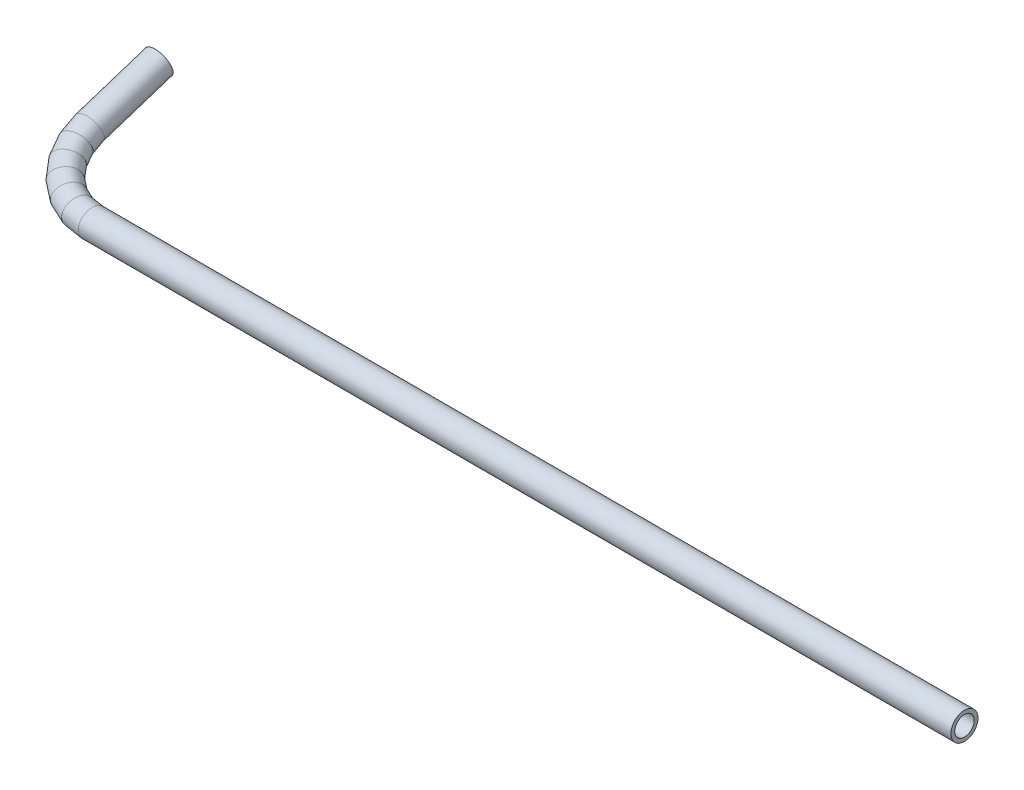
ISO-10303-21;
HEADER;
FILE_DESCRIPTION(('STEP AP214'),'2;1');
FILE_NAME('part.step','',(''),(''),'','','');
FILE_SCHEMA(('AUTOMOTIVE_DESIGN { 1 0 10303 214 1 1 1 1 }'));
ENDSEC;
DATA;
#1=APPLICATION_CONTEXT('core data for automotive mechanical design processes');
#2=APPLICATION_PROTOCOL_DEFINITION('international standard','automotive_design',2000,#1);
#3=PRODUCT_CONTEXT('',#1,'mechanical');
#4=PRODUCT('Part','Part','',(#3));
#5=PRODUCT_RELATED_PRODUCT_CATEGORY('part','',(#4));
#6=PRODUCT_DEFINITION_FORMATION('','',#4);
#7=PRODUCT_DEFINITION_CONTEXT('part definition',#1,'design');
#8=PRODUCT_DEFINITION('design','',#6,#7);
#9=PRODUCT_DEFINITION_SHAPE('','',#8);
#10=(LENGTH_UNIT() NAMED_UNIT(*) SI_UNIT(.MILLI.,.METRE.));
#11=(NAMED_UNIT(*) PLANE_ANGLE_UNIT() SI_UNIT($,.RADIAN.));
#12=(NAMED_UNIT(*) SI_UNIT($,.STERADIAN.) SOLID_ANGLE_UNIT());
#13=UNCERTAINTY_MEASURE_WITH_UNIT(LENGTH_MEASURE(1.E-05),#10,'distance_accuracy_value','');
#14=(GEOMETRIC_REPRESENTATION_CONTEXT(3) GLOBAL_UNCERTAINTY_ASSIGNED_CONTEXT((#13)) GLOBAL_UNIT_ASSIGNED_CONTEXT((#10,
#11,#12)) REPRESENTATION_CONTEXT('',''));
#15=CARTESIAN_POINT('',(0.,0.,0.));
#16=DIRECTION('',(0.,0.,1.));
#17=DIRECTION('',(1.,0.,0.));
#18=AXIS2_PLACEMENT_3D('',#15,#16,#17);
#19=CARTESIAN_POINT('',(-2114.18796047896,14.6909208859759,-45.2140053567118));
#20=DIRECTION('',(0.,0.309016994374947,-0.951056516295154));
#21=DIRECTION('',(0.,0.951056516295154,0.309016994374947));
#22=AXIS2_PLACEMENT_3D('',#19,#20,#21);
#23=CYLINDRICAL_SURFACE('',#22,3.175);
#24=CARTESIAN_POINT('',(-2114.18796047896,14.8328157299976,-45.6507127821674));
#25=DIRECTION('',(-0.0654031292301812,0.308355365269414,-0.949020231289337));
#26=DIRECTION('',(-0.997858923238601,-0.0202106784174268,0.0622020722404579));
#27=AXIS2_PLACEMENT_3D('',#24,#25,#26);
#28=ELLIPSE('',#27,3.18181250481318,3.175);
#29=CARTESIAN_POINT('',(-2117.36296047896,14.7685091406783,-45.4527974508874));
#30=VERTEX_POINT('',#29);
#31=EDGE_CURVE('E45',#30,#30,#28,.T.);
#32=ORIENTED_EDGE('',*,*,#31,.T.);
#33=EDGE_LOOP('',(#32));
#34=FACE_BOUND('',#33,.T.);
#35=CARTESIAN_POINT('',(-2114.18796047896,20.1324571835283,-61.9613320366301));
#36=DIRECTION('',(0.,-0.309016994374947,0.951056516295154));
#37=DIRECTION('',(0.951056516295154,-0.293892626146236,-0.0954915028125263));
#38=AXIS2_PLACEMENT_3D('',#35,#36,#37);
#39=CIRCLE('',#38,3.175);
#40=CARTESIAN_POINT('',(-2111.16835603972,19.199348095514,-62.2645175580599));
#41=VERTEX_POINT('',#40);
#42=EDGE_CURVE('E80',#41,#41,#39,.T.);
#43=ORIENTED_EDGE('',*,*,#42,.T.);
#44=EDGE_LOOP('',(#43));
#45=FACE_BOUND('',#44,.T.);
#46=ADVANCED_FACE('F39',(#34,#45),#23,.T.);
#47=CARTESIAN_POINT('',(-2113.56962555546,13.3814494203846,-41.1838665846604));
#48=DIRECTION('',(-0.130526192220127,0.306373311150218,-0.942920095956898));
#49=DIRECTION('',(0.,0.951056516295154,0.309016994374947));
#50=AXIS2_PLACEMENT_3D('',#47,#48,#49);
#51=CYLINDRICAL_SURFACE('',#50,3.175);
#52=CARTESIAN_POINT('',(-2113.67684787329,13.6331234789287,-41.9584396913768));
#53=DIRECTION('',(-0.258819045102505,0.298487495628987,-0.918650051350003));
#54=DIRECTION('',(-0.965925826289073,-0.0799794834045707,0.246151539386026));
#55=AXIS2_PLACEMENT_3D('',#52,#53,#54);
#56=ELLIPSE('',#55,3.20239694984194,3.175);
#57=CARTESIAN_POINT('',(-2116.77012579318,13.376997425224,-41.170164752448));
#58=VERTEX_POINT('',#57);
#59=EDGE_CURVE('E94',#58,#58,#56,.T.);
#60=ORIENTED_EDGE('',*,*,#59,.T.);
#61=EDGE_LOOP('',(#60));
#62=FACE_BOUND('',#61,.T.);
#63=ORIENTED_EDGE('',*,*,#31,.F.);
#64=EDGE_LOOP('',(#63));
#65=FACE_BOUND('',#64,.T.);
#66=ADVANCED_FACE('F103',(#62,#65),#51,.T.);
#67=CARTESIAN_POINT('',(-2111.86398160601,12.2806653848193,-37.7960016804169));
#68=DIRECTION('',(-0.382683432364989,0.285494476301182,-0.878661649666619));
#69=DIRECTION('',(-0.916819345772618,0.,0.399302250453298));
#70=AXIS2_PLACEMENT_3D('',#67,#68,#69);
#71=CYLINDRICAL_SURFACE('',#70,3.175);
#72=CARTESIAN_POINT('',(-2112.17834153572,12.5151882721854,-38.5177889099537));
#73=DIRECTION('',(-0.499999999999964,0.267616567329824,-0.823639103546352));
#74=DIRECTION('',(-0.866025403784459,-0.154508497187462,0.475528258147543));
#75=AXIS2_PLACEMENT_3D('',#72,#73,#74);
#76=ELLIPSE('',#75,3.20239694984201,3.175);
#77=CARTESIAN_POINT('',(-2114.95169864729,12.0203907320676,-36.9949586664984));
#78=VERTEX_POINT('',#77);
#79=EDGE_CURVE('E95',#78,#78,#76,.T.);
#80=ORIENTED_EDGE('',*,*,#79,.T.);
#81=EDGE_LOOP('',(#80));
#82=FACE_BOUND('',#81,.T.);
#83=ORIENTED_EDGE('',*,*,#59,.F.);
#84=EDGE_LOOP('',(#83));
#85=FACE_BOUND('',#84,.T.);
#86=ADVANCED_FACE('F104',(#82,#85),#71,.T.);
#87=CARTESIAN_POINT('',(-2109.29448776485,11.3538061776507,-34.9434223572345));
#88=DIRECTION('',(-0.608761429008741,0.245159664694118,-0.75452386400849));
#89=DIRECTION('',(-0.778274692967017,0.,0.627923962185786));
#90=AXIS2_PLACEMENT_3D('',#87,#88,#89);
#91=CYLINDRICAL_SURFACE('',#90,3.175);
#92=CARTESIAN_POINT('',(-2109.79456219676,11.5551955466312,-35.5632351027078));
#93=DIRECTION('',(-0.707106781186574,0.218508012224402,-0.672498511963932));
#94=DIRECTION('',(-0.707106781186521,-0.218508012224418,0.672498511963983));
#95=AXIS2_PLACEMENT_3D('',#92,#93,#94);
#96=ELLIPSE('',#95,3.20239694984199,3.175);
#97=CARTESIAN_POINT('',(-2112.05899879604,10.8554461547677,-33.409627919221));
#98=VERTEX_POINT('',#97);
#99=EDGE_CURVE('E90',#98,#98,#96,.T.);
#100=ORIENTED_EDGE('',*,*,#99,.T.);
#101=EDGE_LOOP('',(#100));
#102=FACE_BOUND('',#101,.T.);
#103=ORIENTED_EDGE('',*,*,#79,.F.);
#104=EDGE_LOOP('',(#103));
#105=FACE_BOUND('',#104,.T.);
#106=ADVANCED_FACE('F109',(#102,#105),#91,.T.);
#107=CARTESIAN_POINT('',(-2106.03625079099,10.6640357221394,-32.8205271818773));
#108=DIRECTION('',(-0.793353340291265,0.188117627083661,-0.578966523927856));
#109=DIRECTION('',(-0.589490998187417,0.,0.807774945796168));
#110=AXIS2_PLACEMENT_3D('',#107,#108,#109);
#111=CYLINDRICAL_SURFACE('',#110,3.175);
#112=CARTESIAN_POINT('',(-2106.68796047896,10.8185672200502,-33.2961262289724));
#113=DIRECTION('',(-0.866025403784444,0.154508497187471,-0.475528258147568));
#114=DIRECTION('',(-0.49999999999999,-0.267616567329823,0.823639103546336));
#115=AXIS2_PLACEMENT_3D('',#112,#113,#114);
#116=ELLIPSE('',#115,3.20239694984197,3.175);
#117=CARTESIAN_POINT('',(-2108.28915895388,9.96155274110603,-30.658506876005));
#118=VERTEX_POINT('',#117);
#119=EDGE_CURVE('E88',#118,#118,#116,.T.);
#120=ORIENTED_EDGE('',*,*,#119,.T.);
#121=EDGE_LOOP('',(#120));
#122=FACE_BOUND('',#121,.T.);
#123=ORIENTED_EDGE('',*,*,#99,.F.);
#124=EDGE_LOOP('',(#123));
#125=FACE_BOUND('',#124,.T.);
#126=ADVANCED_FACE('F169',(#122,#125),#111,.T.);
#127=CARTESIAN_POINT('',(-2102.3113141497,10.2583607349288,-31.5719879522953));
#128=DIRECTION('',(-0.923879532511276,0.118255684066556,-0.363953572029039));
#129=DIRECTION('',(-0.366525415369712,0.,0.93040803945799));
#130=AXIS2_PLACEMENT_3D('',#127,#128,#129);
#131=CYLINDRICAL_SURFACE('',#130,3.175);
#132=CARTESIAN_POINT('',(-2103.0702461555,10.3555032955627,-31.8709620119174));
#133=DIRECTION('',(-0.965925826289065,0.0799794834045782,-0.246151539386052));
#134=DIRECTION('',(-0.258819045102532,-0.29848749562898,0.918650051349998));
#135=AXIS2_PLACEMENT_3D('',#132,#133,#134);
#136=ELLIPSE('',#135,3.20239694984199,3.175);
#137=CARTESIAN_POINT('',(-2103.89908747609,9.3996278499945,-28.929079889502));
#138=VERTEX_POINT('',#137);
#139=EDGE_CURVE('E82',#138,#138,#136,.T.);
#140=ORIENTED_EDGE('',*,*,#139,.T.);
#141=EDGE_LOOP('',(#140));
#142=FACE_BOUND('',#141,.T.);
#143=ORIENTED_EDGE('',*,*,#119,.F.);
#144=EDGE_LOOP('',(#143));
#145=FACE_BOUND('',#144,.T.);
#146=ADVANCED_FACE('F163',(#142,#145),#131,.T.);
#147=CARTESIAN_POINT('',(-2098.73270747824,10.1790398206875,-31.3278632803811));
#148=DIRECTION('',(-0.991444861373811,0.0403348116070459,-0.124137785658069));
#149=DIRECTION('',(-0.124238888735265,0.,0.992252336115076));
#150=AXIS2_PLACEMENT_3D('',#147,#148,#149);
#151=CYLINDRICAL_SURFACE('',#150,3.175);
#152=CARTESIAN_POINT('',(-2099.18796047896,10.1975608143733,-31.3848650377401));
#153=DIRECTION('',(-0.997858923238604,0.0202106784174145,-0.0622020722404191));
#154=DIRECTION('',(-0.0654031292301406,-0.308355365269418,0.949020231289338));
#155=AXIS2_PLACEMENT_3D('',#152,#153,#154);
#156=ELLIPSE('',#155,3.18181250481317,3.175);
#157=CARTESIAN_POINT('',(-2099.3960609734,9.21643185723279,-28.365260598503));
#158=VERTEX_POINT('',#157);
#159=EDGE_CURVE('E78',#158,#158,#156,.T.);
#160=ORIENTED_EDGE('',*,*,#159,.T.);
#161=EDGE_LOOP('',(#160));
#162=FACE_BOUND('',#161,.T.);
#163=ORIENTED_EDGE('',*,*,#139,.F.);
#164=EDGE_LOOP('',(#163));
#165=FACE_BOUND('',#164,.T.);
#166=ADVANCED_FACE('F159',(#162,#165),#151,.T.);
#167=CARTESIAN_POINT('',(-1894.68796047896,10.1975608143733,-31.3848650377401));
#168=DIRECTION('',(-1.,0.,0.));
#169=DIRECTION('',(0.,0.,1.));
#170=AXIS2_PLACEMENT_3D('',#167,#168,#169);
#171=CYLINDRICAL_SURFACE('',#170,3.175);
#172=CARTESIAN_POINT('',(-1894.68796047896,10.1975608143733,-31.3848650377401));
#173=DIRECTION('',(1.,0.,0.));
#174=DIRECTION('',(0.,0.,-1.));
#175=AXIS2_PLACEMENT_3D('',#172,#173,#174);
#176=CIRCLE('',#175,3.175);
#177=CARTESIAN_POINT('',(-1894.68796047896,10.1975608143733,-34.5598650377401));
#178=VERTEX_POINT('',#177);
#179=EDGE_CURVE('E74',#178,#178,#176,.T.);
#180=ORIENTED_EDGE('',*,*,#179,.F.);
#181=EDGE_LOOP('',(#180));
#182=FACE_BOUND('',#181,.T.);
#183=ORIENTED_EDGE('',*,*,#159,.F.);
#184=EDGE_LOOP('',(#183));
#185=FACE_BOUND('',#184,.T.);
#186=ADVANCED_FACE('F156',(#182,#185),#171,.T.);
#187=CARTESIAN_POINT('',(-2114.18796047896,20.1324571835283,-61.9613320366301));
#188=DIRECTION('',(0.,-0.309016994374947,0.951056516295154));
#189=DIRECTION('',(0.951056516295154,-0.293892626146236,-0.0954915028125263));
#190=AXIS2_PLACEMENT_3D('',#187,#188,#189);
#191=PLANE('',#190);
#192=CARTESIAN_POINT('',(-2114.18796047896,20.1324571835283,-61.9613320366301));
#193=DIRECTION('',(0.,-0.309016994374947,0.951056516295154));
#194=DIRECTION('',(0.951056516295154,-0.293892626146236,-0.0954915028125263));
#195=AXIS2_PLACEMENT_3D('',#192,#193,#194);
#196=CIRCLE('',#195,2.286);
#197=CARTESIAN_POINT('',(-2112.01384528271,19.460618640158,-62.1796256120596));
#198=VERTEX_POINT('',#197);
#199=EDGE_CURVE('E72',#198,#198,#196,.F.);
#200=ORIENTED_EDGE('',*,*,#199,.F.);
#201=EDGE_LOOP('',(#200));
#202=FACE_BOUND('',#201,.T.);
#203=ORIENTED_EDGE('',*,*,#42,.F.);
#204=EDGE_LOOP('',(#203));
#205=FACE_BOUND('',#204,.T.);
#206=ADVANCED_FACE('F155',(#202,#205),#191,.F.);
#207=CARTESIAN_POINT('',(-1894.68796047896,10.1975608143733,-31.3848650377401));
#208=DIRECTION('',(1.,0.,0.));
#209=DIRECTION('',(0.,0.,-1.));
#210=AXIS2_PLACEMENT_3D('',#207,#208,#209);
#211=PLANE('',#210);
#212=CARTESIAN_POINT('',(-1894.68796047896,10.1975608143733,-31.3848650377401));
#213=DIRECTION('',(1.,0.,0.));
#214=DIRECTION('',(0.,0.,-1.));
#215=AXIS2_PLACEMENT_3D('',#212,#213,#214);
#216=CIRCLE('',#215,2.286);
#217=CARTESIAN_POINT('',(-1894.68796047896,10.1975608143733,-33.6708650377401));
#218=VERTEX_POINT('',#217);
#219=EDGE_CURVE('E46',#218,#218,#216,.F.);
#220=ORIENTED_EDGE('',*,*,#219,.T.);
#221=EDGE_LOOP('',(#220));
#222=FACE_BOUND('',#221,.T.);
#223=ORIENTED_EDGE('',*,*,#179,.T.);
#224=EDGE_LOOP('',(#223));
#225=FACE_BOUND('',#224,.T.);
#226=ADVANCED_FACE('F146',(#222,#225),#211,.T.);
#227=CARTESIAN_POINT('',(-2114.18796047896,14.7219989664594,-45.3096538533828));
#228=DIRECTION('',(0.,0.309016994374947,-0.951056516295154));
#229=DIRECTION('',(0.,0.951056516295154,0.309016994374947));
#230=AXIS2_PLACEMENT_3D('',#227,#228,#229);
#231=CYLINDRICAL_SURFACE('',#230,2.286);
#232=CARTESIAN_POINT('',(-2114.18796047896,14.8328157299975,-45.6507127821674));
#233=DIRECTION('',(-0.0654031292301812,0.308355365269414,-0.949020231289337));
#234=DIRECTION('',(-0.997858923238601,-0.020210678417426,0.0622020722404581));
#235=AXIS2_PLACEMENT_3D('',#232,#233,#234);
#236=ELLIPSE('',#235,2.29090500346549,2.286);
#237=CARTESIAN_POINT('',(-2116.47396047896,14.7865149856876,-45.5082137436458));
#238=VERTEX_POINT('',#237);
#239=EDGE_CURVE('E67',#238,#238,#236,.F.);
#240=ORIENTED_EDGE('',*,*,#239,.T.);
#241=EDGE_LOOP('',(#240));
#242=FACE_BOUND('',#241,.T.);
#243=ORIENTED_EDGE('',*,*,#199,.T.);
#244=EDGE_LOOP('',(#243));
#245=FACE_BOUND('',#244,.T.);
#246=ADVANCED_FACE('F145',(#242,#245),#231,.F.);
#247=CARTESIAN_POINT('',(-2113.59599307107,13.4433397040646,-41.374345291854));
#248=DIRECTION('',(-0.130526192220127,0.306373311150218,-0.942920095956898));
#249=DIRECTION('',(0.,0.951056516295154,0.309016994374947));
#250=AXIS2_PLACEMENT_3D('',#247,#248,#249);
#251=CYLINDRICAL_SURFACE('',#250,2.286);
#252=CARTESIAN_POINT('',(-2113.67684787329,13.6331234789288,-41.9584396913767));
#253=DIRECTION('',(-0.258819045102505,0.298487495628986,-0.918650051350003));
#254=DIRECTION('',(-0.965925826289073,-0.0799794834045707,0.246151539386026));
#255=AXIS2_PLACEMENT_3D('',#252,#253,#254);
#256=ELLIPSE('',#255,2.3057258038862,2.286);
#257=CARTESIAN_POINT('',(-2115.90400797561,13.4487127202614,-41.3908817353481));
#258=VERTEX_POINT('',#257);
#259=EDGE_CURVE('E63',#258,#258,#256,.F.);
#260=ORIENTED_EDGE('',*,*,#259,.T.);
#261=EDGE_LOOP('',(#260));
#262=FACE_BOUND('',#261,.T.);
#263=ORIENTED_EDGE('',*,*,#239,.F.);
#264=EDGE_LOOP('',(#263));
#265=FACE_BOUND('',#264,.T.);
#266=ADVANCED_FACE('F139',(#262,#265),#251,.F.);
#267=CARTESIAN_POINT('',(-2111.94128725022,12.3383379479454,-37.9734995784962));
#268=DIRECTION('',(-0.382683432364989,0.285494476301182,-0.87866164966662));
#269=DIRECTION('',(-0.916819345772618,0.,0.399302250453298));
#270=AXIS2_PLACEMENT_3D('',#267,#268,#269);
#271=CYLINDRICAL_SURFACE('',#270,2.286);
#272=CARTESIAN_POINT('',(-2112.17834153572,12.5151882721853,-38.5177889099538));
#273=DIRECTION('',(-0.499999999999964,0.267616567329824,-0.823639103546352));
#274=DIRECTION('',(-0.866025403784459,-0.154508497187461,0.475528258147543));
#275=AXIS2_PLACEMENT_3D('',#272,#273,#274);
#276=ELLIPSE('',#275,2.30572580388625,2.286);
#277=CARTESIAN_POINT('',(-2114.17515865605,12.1589340433005,-37.4213511346659));
#278=VERTEX_POINT('',#277);
#279=EDGE_CURVE('E65',#278,#278,#276,.F.);
#280=ORIENTED_EDGE('',*,*,#279,.T.);
#281=EDGE_LOOP('',(#280));
#282=FACE_BOUND('',#281,.T.);
#283=ORIENTED_EDGE('',*,*,#259,.F.);
#284=EDGE_LOOP('',(#283));
#285=FACE_BOUND('',#284,.T.);
#286=ADVANCED_FACE('F136',(#282,#285),#271,.F.);
#287=CARTESIAN_POINT('',(-2109.41746328577,11.4033307303538,-35.0958432577746));
#288=DIRECTION('',(-0.608761429008741,0.245159664694118,-0.75452386400849));
#289=DIRECTION('',(-0.778274692967016,0.,0.627923962185786));
#290=AXIS2_PLACEMENT_3D('',#287,#288,#289);
#291=CYLINDRICAL_SURFACE('',#290,2.286);
#292=CARTESIAN_POINT('',(-2109.79456219676,11.5551955466312,-35.5632351027079));
#293=DIRECTION('',(-0.707106781186574,0.218508012224402,-0.672498511963932));
#294=DIRECTION('',(-0.707106781186521,-0.218508012224418,0.672498511963983));
#295=AXIS2_PLACEMENT_3D('',#292,#293,#294);
#296=ELLIPSE('',#295,2.30572580388623,2.286);
#297=CARTESIAN_POINT('',(-2111.42495654824,11.0513759844895,-34.0126379305974));
#298=VERTEX_POINT('',#297);
#299=EDGE_CURVE('E56',#298,#298,#296,.F.);
#300=ORIENTED_EDGE('',*,*,#299,.T.);
#301=EDGE_LOOP('',(#300));
#302=FACE_BOUND('',#301,.T.);
#303=ORIENTED_EDGE('',*,*,#279,.F.);
#304=EDGE_LOOP('',(#303));
#305=FACE_BOUND('',#304,.T.);
#306=ADVANCED_FACE('F135',(#302,#305),#291,.F.);
#307=CARTESIAN_POINT('',(-2106.19651561009,10.702037247996,-32.9374838523937));
#308=DIRECTION('',(-0.793353340291266,0.188117627083661,-0.578966523927856));
#309=DIRECTION('',(-0.589490998187417,0.,0.807774945796168));
#310=AXIS2_PLACEMENT_3D('',#307,#308,#309);
#311=CYLINDRICAL_SURFACE('',#310,2.286);
#312=CARTESIAN_POINT('',(-2106.68796047896,10.8185672200502,-33.2961262289722));
#313=DIRECTION('',(-0.866025403784444,0.154508497187471,-0.475528258147568));
#314=DIRECTION('',(-0.499999999999991,-0.267616567329823,0.823639103546336));
#315=AXIS2_PLACEMENT_3D('',#312,#313,#314);
#316=ELLIPSE('',#315,2.30572580388621,2.286);
#317=CARTESIAN_POINT('',(-2107.8408233809,10.2015167952104,-31.3970402948357));
#318=VERTEX_POINT('',#317);
#319=EDGE_CURVE('E57',#318,#318,#316,.F.);
#320=ORIENTED_EDGE('',*,*,#319,.T.);
#321=EDGE_LOOP('',(#320));
#322=FACE_BOUND('',#321,.T.);
#323=ORIENTED_EDGE('',*,*,#299,.F.);
#324=EDGE_LOOP('',(#323));
#325=FACE_BOUND('',#324,.T.);
#326=ADVANCED_FACE('F126',(#322,#325),#311,.F.);
#327=CARTESIAN_POINT('',(-2102.49794648441,10.2822494927525,-31.6455099889726));
#328=DIRECTION('',(-0.923879532511276,0.118255684066556,-0.363953572029039));
#329=DIRECTION('',(-0.366525415369712,0.,0.93040803945799));
#330=AXIS2_PLACEMENT_3D('',#327,#328,#329);
#331=CYLINDRICAL_SURFACE('',#330,2.286);
#332=CARTESIAN_POINT('',(-2103.0702461555,10.3555032955627,-31.8709620119174));
#333=DIRECTION('',(-0.965925826289065,0.0799794834045782,-0.246151539386052));
#334=DIRECTION('',(-0.258819045102532,-0.29848749562898,0.918650051349998));
#335=AXIS2_PLACEMENT_3D('',#332,#333,#334);
#336=ELLIPSE('',#335,2.30572580388623,2.286);
#337=CARTESIAN_POINT('',(-2103.66701190633,9.6672729747536,-29.7528068837783));
#338=VERTEX_POINT('',#337);
#339=EDGE_CURVE('E51',#338,#338,#336,.F.);
#340=ORIENTED_EDGE('',*,*,#339,.T.);
#341=EDGE_LOOP('',(#340));
#342=FACE_BOUND('',#341,.T.);
#343=ORIENTED_EDGE('',*,*,#319,.F.);
#344=EDGE_LOOP('',(#343));
#345=FACE_BOUND('',#344,.T.);
#346=ADVANCED_FACE('F121',(#342,#345),#331,.F.);
#347=CARTESIAN_POINT('',(-2098.83241786233,10.1830963241945,-31.3403479144432));
#348=DIRECTION('',(-0.991444861373811,0.0403348116070459,-0.124137785658069));
#349=DIRECTION('',(-0.124238888735265,0.,0.992252336115076));
#350=AXIS2_PLACEMENT_3D('',#347,#348,#349);
#351=CYLINDRICAL_SURFACE('',#350,2.286);
#352=CARTESIAN_POINT('',(-2099.18796047896,10.1975608143733,-31.3848650377401));
#353=DIRECTION('',(-0.997858923238604,0.0202106784174146,-0.0622020722404192));
#354=DIRECTION('',(-0.0654031292301406,-0.308355365269418,0.949020231289338));
#355=AXIS2_PLACEMENT_3D('',#352,#353,#354);
#356=ELLIPSE('',#355,2.29090500346548,2.286);
#357=CARTESIAN_POINT('',(-2099.33779283495,9.49114796523212,-29.2107498414894));
#358=VERTEX_POINT('',#357);
#359=EDGE_CURVE('E10',#358,#358,#356,.F.);
#360=ORIENTED_EDGE('',*,*,#359,.T.);
#361=EDGE_LOOP('',(#360));
#362=FACE_BOUND('',#361,.T.);
#363=ORIENTED_EDGE('',*,*,#339,.F.);
#364=EDGE_LOOP('',(#363));
#365=FACE_BOUND('',#364,.T.);
#366=ADVANCED_FACE('F113',(#362,#365),#351,.F.);
#367=CARTESIAN_POINT('',(-1894.68796047896,10.1975608143733,-31.3848650377401));
#368=DIRECTION('',(-1.,0.,0.));
#369=DIRECTION('',(0.,0.,1.));
#370=AXIS2_PLACEMENT_3D('',#367,#368,#369);
#371=CYLINDRICAL_SURFACE('',#370,2.286);
#372=ORIENTED_EDGE('',*,*,#219,.F.);
#373=EDGE_LOOP('',(#372));
#374=FACE_BOUND('',#373,.T.);
#375=ORIENTED_EDGE('',*,*,#359,.F.);
#376=EDGE_LOOP('',(#375));
#377=FACE_BOUND('',#376,.T.);
#378=ADVANCED_FACE('F114',(#374,#377),#371,.F.);
#379=CLOSED_SHELL('',(#46,#66,#86,#106,#126,#146,#166,#186,#206,#226,#246,#266,#286,#306,#326,
#346,#366,#378));
#380=MANIFOLD_SOLID_BREP('B2',#379);
#381=ADVANCED_BREP_SHAPE_REPRESENTATION('',(#18,#380),#14);
#382=SHAPE_DEFINITION_REPRESENTATION(#9,#381);
ENDSEC;
END-ISO-10303-21;
